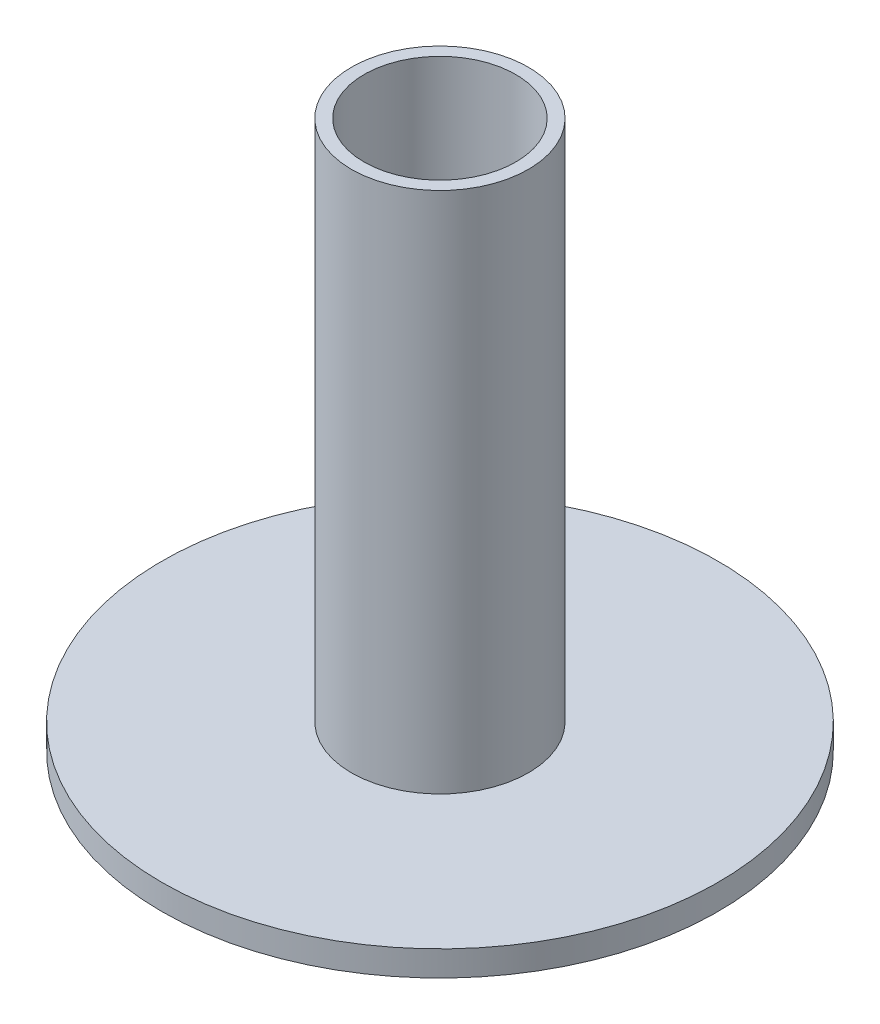
ISO-10303-21;
HEADER;
FILE_DESCRIPTION(('STEP AP214'),'2;1');
FILE_NAME('part.step','',(''),(''),'','','');
FILE_SCHEMA(('AUTOMOTIVE_DESIGN { 1 0 10303 214 1 1 1 1 }'));
ENDSEC;
DATA;
#1=APPLICATION_CONTEXT('core data for automotive mechanical design processes');
#2=APPLICATION_PROTOCOL_DEFINITION('international standard','automotive_design',2000,#1);
#3=PRODUCT_CONTEXT('',#1,'mechanical');
#4=PRODUCT('Part','Part','',(#3));
#5=PRODUCT_RELATED_PRODUCT_CATEGORY('part','',(#4));
#6=PRODUCT_DEFINITION_FORMATION('','',#4);
#7=PRODUCT_DEFINITION_CONTEXT('part definition',#1,'design');
#8=PRODUCT_DEFINITION('design','',#6,#7);
#9=PRODUCT_DEFINITION_SHAPE('','',#8);
#10=(LENGTH_UNIT() NAMED_UNIT(*) SI_UNIT(.MILLI.,.METRE.));
#11=(NAMED_UNIT(*) PLANE_ANGLE_UNIT() SI_UNIT($,.RADIAN.));
#12=(NAMED_UNIT(*) SI_UNIT($,.STERADIAN.) SOLID_ANGLE_UNIT());
#13=UNCERTAINTY_MEASURE_WITH_UNIT(LENGTH_MEASURE(1.E-05),#10,'distance_accuracy_value','');
#14=(GEOMETRIC_REPRESENTATION_CONTEXT(3) GLOBAL_UNCERTAINTY_ASSIGNED_CONTEXT((#13)) GLOBAL_UNIT_ASSIGNED_CONTEXT((#10,
#11,#12)) REPRESENTATION_CONTEXT('',''));
#15=CARTESIAN_POINT('',(0.,0.,0.));
#16=DIRECTION('',(0.,0.,1.));
#17=DIRECTION('',(1.,0.,0.));
#18=AXIS2_PLACEMENT_3D('',#15,#16,#17);
#19=CARTESIAN_POINT('',(0.,3.,0.));
#20=DIRECTION('',(0.,-1.,0.));
#21=DIRECTION('',(0.,0.,-1.));
#22=AXIS2_PLACEMENT_3D('',#19,#20,#21);
#23=CYLINDRICAL_SURFACE('',#22,33.);
#24=CARTESIAN_POINT('',(0.,3.,0.));
#25=DIRECTION('',(0.,1.,0.));
#26=DIRECTION('',(0.,0.,1.));
#27=AXIS2_PLACEMENT_3D('',#24,#25,#26);
#28=CIRCLE('',#27,33.);
#29=CARTESIAN_POINT('',(0.,3.,33.));
#30=VERTEX_POINT('',#29);
#31=EDGE_CURVE('E40',#30,#30,#28,.T.);
#32=ORIENTED_EDGE('',*,*,#31,.F.);
#33=EDGE_LOOP('',(#32));
#34=FACE_BOUND('',#33,.T.);
#35=CARTESIAN_POINT('',(0.,0.,0.));
#36=DIRECTION('',(0.,1.,0.));
#37=DIRECTION('',(0.,0.,1.));
#38=AXIS2_PLACEMENT_3D('',#35,#36,#37);
#39=CIRCLE('',#38,33.);
#40=CARTESIAN_POINT('',(0.,0.,33.));
#41=VERTEX_POINT('',#40);
#42=EDGE_CURVE('E36',#41,#41,#39,.T.);
#43=ORIENTED_EDGE('',*,*,#42,.T.);
#44=EDGE_LOOP('',(#43));
#45=FACE_BOUND('',#44,.T.);
#46=ADVANCED_FACE('F33',(#34,#45),#23,.T.);
#47=CARTESIAN_POINT('',(0.,3.,0.));
#48=DIRECTION('',(0.,1.,0.));
#49=DIRECTION('',(0.,0.,1.));
#50=AXIS2_PLACEMENT_3D('',#47,#48,#49);
#51=PLANE('',#50);
#52=CARTESIAN_POINT('',(0.,3.,0.));
#53=DIRECTION('',(0.,1.,0.));
#54=DIRECTION('',(0.,0.,1.));
#55=AXIS2_PLACEMENT_3D('',#52,#53,#54);
#56=CIRCLE('',#55,10.5);
#57=CARTESIAN_POINT('',(0.,3.,10.5));
#58=VERTEX_POINT('',#57);
#59=EDGE_CURVE('E10',#58,#58,#56,.T.);
#60=ORIENTED_EDGE('',*,*,#59,.F.);
#61=EDGE_LOOP('',(#60));
#62=FACE_BOUND('',#61,.T.);
#63=ORIENTED_EDGE('',*,*,#31,.T.);
#64=EDGE_LOOP('',(#63));
#65=FACE_BOUND('',#64,.T.);
#66=ADVANCED_FACE('F85',(#62,#65),#51,.T.);
#67=CARTESIAN_POINT('',(0.,0.,0.));
#68=DIRECTION('',(0.,1.,0.));
#69=DIRECTION('',(0.,0.,1.));
#70=AXIS2_PLACEMENT_3D('',#67,#68,#69);
#71=PLANE('',#70);
#72=CARTESIAN_POINT('',(0.,0.,0.));
#73=DIRECTION('',(0.,-1.,0.));
#74=DIRECTION('',(0.,0.,-1.));
#75=AXIS2_PLACEMENT_3D('',#72,#73,#74);
#76=CIRCLE('',#75,8.75);
#77=CARTESIAN_POINT('',(0.,0.,-8.75));
#78=VERTEX_POINT('',#77);
#79=EDGE_CURVE('E50',#78,#78,#76,.T.);
#80=ORIENTED_EDGE('',*,*,#79,.F.);
#81=EDGE_LOOP('',(#80));
#82=FACE_BOUND('',#81,.T.);
#83=ORIENTED_EDGE('',*,*,#42,.F.);
#84=EDGE_LOOP('',(#83));
#85=FACE_BOUND('',#84,.T.);
#86=ADVANCED_FACE('F80',(#82,#85),#71,.F.);
#87=CARTESIAN_POINT('',(0.,65.,0.));
#88=DIRECTION('',(0.,-1.,0.));
#89=DIRECTION('',(0.,0.,-1.));
#90=AXIS2_PLACEMENT_3D('',#87,#88,#89);
#91=CYLINDRICAL_SURFACE('',#90,10.5);
#92=CARTESIAN_POINT('',(0.,65.,0.));
#93=DIRECTION('',(0.,1.,0.));
#94=DIRECTION('',(0.,0.,1.));
#95=AXIS2_PLACEMENT_3D('',#92,#93,#94);
#96=CIRCLE('',#95,10.5);
#97=CARTESIAN_POINT('',(0.,65.,10.5));
#98=VERTEX_POINT('',#97);
#99=EDGE_CURVE('E46',#98,#98,#96,.T.);
#100=ORIENTED_EDGE('',*,*,#99,.F.);
#101=EDGE_LOOP('',(#100));
#102=FACE_BOUND('',#101,.T.);
#103=ORIENTED_EDGE('',*,*,#59,.T.);
#104=EDGE_LOOP('',(#103));
#105=FACE_BOUND('',#104,.T.);
#106=ADVANCED_FACE('F75',(#102,#105),#91,.T.);
#107=CARTESIAN_POINT('',(0.,65.,0.));
#108=DIRECTION('',(0.,1.,0.));
#109=DIRECTION('',(0.,0.,1.));
#110=AXIS2_PLACEMENT_3D('',#107,#108,#109);
#111=PLANE('',#110);
#112=CARTESIAN_POINT('',(0.,65.,0.));
#113=DIRECTION('',(0.,1.,0.));
#114=DIRECTION('',(0.,0.,1.));
#115=AXIS2_PLACEMENT_3D('',#112,#113,#114);
#116=CIRCLE('',#115,9.);
#117=CARTESIAN_POINT('',(0.,65.,9.));
#118=VERTEX_POINT('',#117);
#119=EDGE_CURVE('E56',#118,#118,#116,.T.);
#120=ORIENTED_EDGE('',*,*,#119,.F.);
#121=EDGE_LOOP('',(#120));
#122=FACE_BOUND('',#121,.T.);
#123=ORIENTED_EDGE('',*,*,#99,.T.);
#124=EDGE_LOOP('',(#123));
#125=FACE_BOUND('',#124,.T.);
#126=ADVANCED_FACE('F71',(#122,#125),#111,.T.);
#127=CARTESIAN_POINT('',(0.,10.,0.));
#128=DIRECTION('',(0.,-1.,0.));
#129=DIRECTION('',(0.,0.,-1.));
#130=AXIS2_PLACEMENT_3D('',#127,#128,#129);
#131=CYLINDRICAL_SURFACE('',#130,8.75);
#132=CARTESIAN_POINT('',(0.,10.,0.));
#133=DIRECTION('',(0.,-1.,0.));
#134=DIRECTION('',(0.,0.,-1.));
#135=AXIS2_PLACEMENT_3D('',#132,#133,#134);
#136=CIRCLE('',#135,8.75);
#137=CARTESIAN_POINT('',(0.,10.,-8.75));
#138=VERTEX_POINT('',#137);
#139=EDGE_CURVE('E49',#138,#138,#136,.T.);
#140=ORIENTED_EDGE('',*,*,#139,.F.);
#141=EDGE_LOOP('',(#140));
#142=FACE_BOUND('',#141,.T.);
#143=ORIENTED_EDGE('',*,*,#79,.T.);
#144=EDGE_LOOP('',(#143));
#145=FACE_BOUND('',#144,.T.);
#146=ADVANCED_FACE('F74',(#142,#145),#131,.F.);
#147=CARTESIAN_POINT('',(0.,10.,0.));
#148=DIRECTION('',(0.,-1.,0.));
#149=DIRECTION('',(0.,0.,-1.));
#150=AXIS2_PLACEMENT_3D('',#147,#148,#149);
#151=PLANE('',#150);
#152=ORIENTED_EDGE('',*,*,#139,.T.);
#153=EDGE_LOOP('',(#152));
#154=FACE_BOUND('',#153,.T.);
#155=ADVANCED_FACE('F67',(#154),#151,.T.);
#156=CARTESIAN_POINT('',(0.,30.,0.));
#157=DIRECTION('',(0.,1.,0.));
#158=DIRECTION('',(0.,0.,1.));
#159=AXIS2_PLACEMENT_3D('',#156,#157,#158);
#160=CYLINDRICAL_SURFACE('',#159,9.);
#161=CARTESIAN_POINT('',(0.,30.,0.));
#162=DIRECTION('',(0.,1.,0.));
#163=DIRECTION('',(0.,0.,1.));
#164=AXIS2_PLACEMENT_3D('',#161,#162,#163);
#165=CIRCLE('',#164,9.);
#166=CARTESIAN_POINT('',(0.,30.,9.));
#167=VERTEX_POINT('',#166);
#168=EDGE_CURVE('E53',#167,#167,#165,.T.);
#169=ORIENTED_EDGE('',*,*,#168,.F.);
#170=EDGE_LOOP('',(#169));
#171=FACE_BOUND('',#170,.T.);
#172=ORIENTED_EDGE('',*,*,#119,.T.);
#173=EDGE_LOOP('',(#172));
#174=FACE_BOUND('',#173,.T.);
#175=ADVANCED_FACE('F64',(#171,#174),#160,.F.);
#176=CARTESIAN_POINT('',(0.,30.,0.));
#177=DIRECTION('',(0.,1.,0.));
#178=DIRECTION('',(0.,0.,1.));
#179=AXIS2_PLACEMENT_3D('',#176,#177,#178);
#180=PLANE('',#179);
#181=ORIENTED_EDGE('',*,*,#168,.T.);
#182=EDGE_LOOP('',(#181));
#183=FACE_BOUND('',#182,.T.);
#184=ADVANCED_FACE('F62',(#183),#180,.T.);
#185=CLOSED_SHELL('',(#46,#66,#86,#106,#126,#146,#155,#175,#184));
#186=MANIFOLD_SOLID_BREP('B2',#185);
#187=ADVANCED_BREP_SHAPE_REPRESENTATION('',(#18,#186),#14);
#188=SHAPE_DEFINITION_REPRESENTATION(#9,#187);
ENDSEC;
END-ISO-10303-21;
